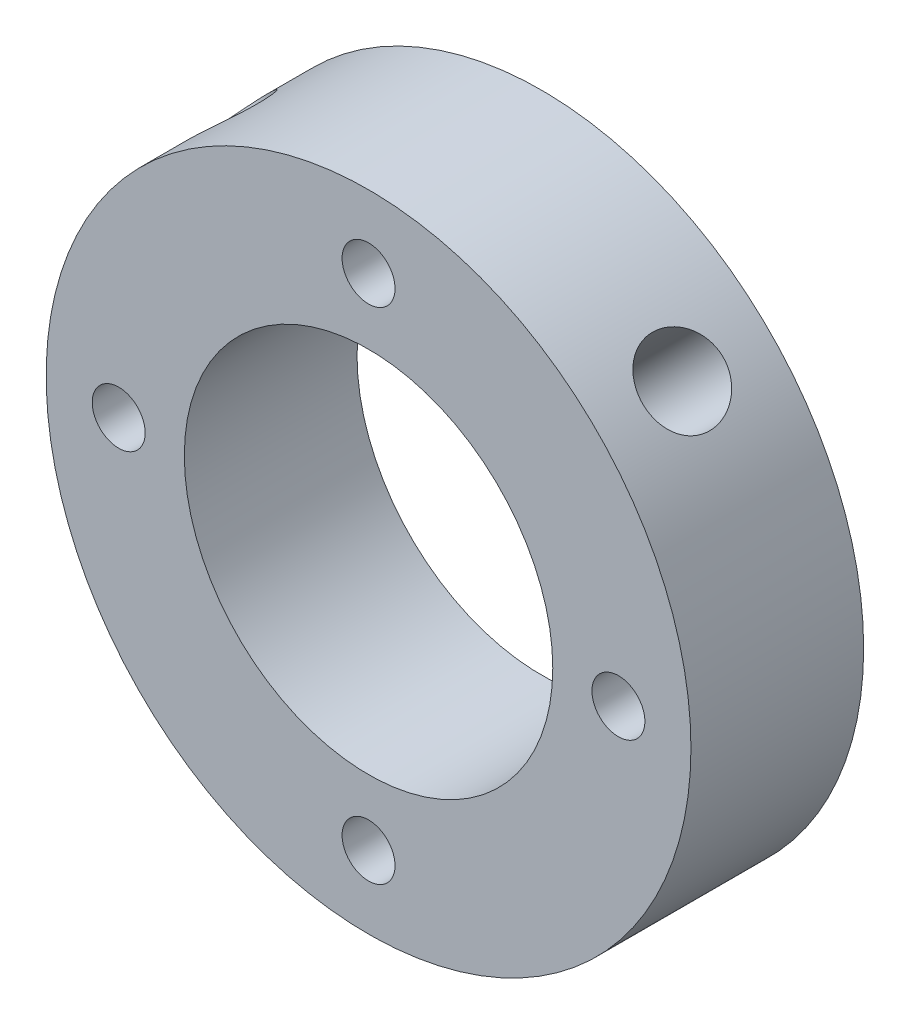
ISO-10303-21;
HEADER;
FILE_DESCRIPTION(('STEP AP214'),'2;1');
FILE_NAME('part.step','',(''),(''),'','','');
FILE_SCHEMA(('AUTOMOTIVE_DESIGN { 1 0 10303 214 1 1 1 1 }'));
ENDSEC;
DATA;
#1=APPLICATION_CONTEXT('core data for automotive mechanical design processes');
#2=APPLICATION_PROTOCOL_DEFINITION('international standard','automotive_design',2000,#1);
#3=PRODUCT_CONTEXT('',#1,'mechanical');
#4=PRODUCT('Part','Part','',(#3));
#5=PRODUCT_RELATED_PRODUCT_CATEGORY('part','',(#4));
#6=PRODUCT_DEFINITION_FORMATION('','',#4);
#7=PRODUCT_DEFINITION_CONTEXT('part definition',#1,'design');
#8=PRODUCT_DEFINITION('design','',#6,#7);
#9=PRODUCT_DEFINITION_SHAPE('','',#8);
#10=(LENGTH_UNIT() NAMED_UNIT(*) SI_UNIT(.MILLI.,.METRE.));
#11=(NAMED_UNIT(*) PLANE_ANGLE_UNIT() SI_UNIT($,.RADIAN.));
#12=(NAMED_UNIT(*) SI_UNIT($,.STERADIAN.) SOLID_ANGLE_UNIT());
#13=UNCERTAINTY_MEASURE_WITH_UNIT(LENGTH_MEASURE(1.E-05),#10,'distance_accuracy_value','');
#14=(GEOMETRIC_REPRESENTATION_CONTEXT(3) GLOBAL_UNCERTAINTY_ASSIGNED_CONTEXT((#13)) GLOBAL_UNIT_ASSIGNED_CONTEXT((#10,
#11,#12)) REPRESENTATION_CONTEXT('',''));
#15=CARTESIAN_POINT('',(0.,0.,0.));
#16=DIRECTION('',(0.,0.,1.));
#17=DIRECTION('',(1.,0.,0.));
#18=AXIS2_PLACEMENT_3D('',#15,#16,#17);
#19=CARTESIAN_POINT('',(0.,0.,9.5));
#20=DIRECTION('',(0.,0.,1.));
#21=DIRECTION('',(1.,0.,0.));
#22=AXIS2_PLACEMENT_3D('',#19,#20,#21);
#23=PLANE('',#22);
#24=CARTESIAN_POINT('',(0.,10.85,9.5));
#25=DIRECTION('',(0.,0.,1.));
#26=DIRECTION('',(1.,0.,0.));
#27=AXIS2_PLACEMENT_3D('',#24,#25,#26);
#28=CIRCLE('',#27,1.15);
#29=CARTESIAN_POINT('',(1.15,10.85,9.5));
#30=VERTEX_POINT('',#29);
#31=EDGE_CURVE('E97',#30,#30,#28,.T.);
#32=ORIENTED_EDGE('',*,*,#31,.F.);
#33=EDGE_LOOP('',(#32));
#34=FACE_BOUND('',#33,.T.);
#35=CARTESIAN_POINT('',(10.85,0.,9.5));
#36=DIRECTION('',(0.,0.,1.));
#37=DIRECTION('',(1.,0.,0.));
#38=AXIS2_PLACEMENT_3D('',#35,#36,#37);
#39=CIRCLE('',#38,1.15);
#40=CARTESIAN_POINT('',(12.,0.,9.5));
#41=VERTEX_POINT('',#40);
#42=EDGE_CURVE('E100',#41,#41,#39,.T.);
#43=ORIENTED_EDGE('',*,*,#42,.F.);
#44=EDGE_LOOP('',(#43));
#45=FACE_BOUND('',#44,.T.);
#46=CARTESIAN_POINT('',(0.,-10.85,9.5));
#47=DIRECTION('',(0.,0.,1.));
#48=DIRECTION('',(1.,0.,0.));
#49=AXIS2_PLACEMENT_3D('',#46,#47,#48);
#50=CIRCLE('',#49,1.15);
#51=CARTESIAN_POINT('',(1.15,-10.85,9.5));
#52=VERTEX_POINT('',#51);
#53=EDGE_CURVE('E106',#52,#52,#50,.T.);
#54=ORIENTED_EDGE('',*,*,#53,.F.);
#55=EDGE_LOOP('',(#54));
#56=FACE_BOUND('',#55,.T.);
#57=CARTESIAN_POINT('',(-10.85,0.,9.5));
#58=DIRECTION('',(0.,0.,1.));
#59=DIRECTION('',(1.,0.,0.));
#60=AXIS2_PLACEMENT_3D('',#57,#58,#59);
#61=CIRCLE('',#60,1.15);
#62=CARTESIAN_POINT('',(-9.7,0.,9.5));
#63=VERTEX_POINT('',#62);
#64=EDGE_CURVE('E112',#63,#63,#61,.T.);
#65=ORIENTED_EDGE('',*,*,#64,.F.);
#66=EDGE_LOOP('',(#65));
#67=FACE_BOUND('',#66,.T.);
#68=CARTESIAN_POINT('',(0.,0.,9.5));
#69=DIRECTION('',(0.,0.,1.));
#70=DIRECTION('',(1.,0.,0.));
#71=AXIS2_PLACEMENT_3D('',#68,#69,#70);
#72=CIRCLE('',#71,14.);
#73=CARTESIAN_POINT('',(14.,0.,9.5));
#74=VERTEX_POINT('',#73);
#75=EDGE_CURVE('E10',#74,#74,#72,.T.);
#76=ORIENTED_EDGE('',*,*,#75,.T.);
#77=EDGE_LOOP('',(#76));
#78=FACE_BOUND('',#77,.T.);
#79=CARTESIAN_POINT('',(0.,0.,9.5));
#80=DIRECTION('',(0.,0.,1.));
#81=DIRECTION('',(1.,0.,0.));
#82=AXIS2_PLACEMENT_3D('',#79,#80,#81);
#83=CIRCLE('',#82,8.);
#84=CARTESIAN_POINT('',(8.,0.,9.5));
#85=VERTEX_POINT('',#84);
#86=EDGE_CURVE('E56',#85,#85,#83,.T.);
#87=ORIENTED_EDGE('',*,*,#86,.F.);
#88=EDGE_LOOP('',(#87));
#89=FACE_BOUND('',#88,.T.);
#90=ADVANCED_FACE('F37',(#34,#45,#56,#67,#78,#89),#23,.T.);
#91=CARTESIAN_POINT('',(0.,0.,2.));
#92=DIRECTION('',(0.,0.,1.));
#93=DIRECTION('',(1.,0.,0.));
#94=AXIS2_PLACEMENT_3D('',#91,#92,#93);
#95=PLANE('',#94);
#96=CARTESIAN_POINT('',(0.,10.85,2.));
#97=DIRECTION('',(0.,0.,1.));
#98=DIRECTION('',(1.,0.,0.));
#99=AXIS2_PLACEMENT_3D('',#96,#97,#98);
#100=CIRCLE('',#99,1.15);
#101=CARTESIAN_POINT('',(1.15,10.85,2.));
#102=VERTEX_POINT('',#101);
#103=EDGE_CURVE('E94',#102,#102,#100,.T.);
#104=ORIENTED_EDGE('',*,*,#103,.T.);
#105=EDGE_LOOP('',(#104));
#106=FACE_BOUND('',#105,.T.);
#107=CARTESIAN_POINT('',(10.85,0.,2.));
#108=DIRECTION('',(0.,0.,1.));
#109=DIRECTION('',(1.,0.,0.));
#110=AXIS2_PLACEMENT_3D('',#107,#108,#109);
#111=CIRCLE('',#110,1.15);
#112=CARTESIAN_POINT('',(12.,0.,2.));
#113=VERTEX_POINT('',#112);
#114=EDGE_CURVE('E103',#113,#113,#111,.T.);
#115=ORIENTED_EDGE('',*,*,#114,.T.);
#116=EDGE_LOOP('',(#115));
#117=FACE_BOUND('',#116,.T.);
#118=CARTESIAN_POINT('',(0.,-10.85,2.));
#119=DIRECTION('',(0.,0.,1.));
#120=DIRECTION('',(1.,0.,0.));
#121=AXIS2_PLACEMENT_3D('',#118,#119,#120);
#122=CIRCLE('',#121,1.15);
#123=CARTESIAN_POINT('',(1.15,-10.85,2.));
#124=VERTEX_POINT('',#123);
#125=EDGE_CURVE('E109',#124,#124,#122,.T.);
#126=ORIENTED_EDGE('',*,*,#125,.T.);
#127=EDGE_LOOP('',(#126));
#128=FACE_BOUND('',#127,.T.);
#129=CARTESIAN_POINT('',(-10.85,0.,2.));
#130=DIRECTION('',(0.,0.,1.));
#131=DIRECTION('',(1.,0.,0.));
#132=AXIS2_PLACEMENT_3D('',#129,#130,#131);
#133=CIRCLE('',#132,1.15);
#134=CARTESIAN_POINT('',(-9.7,0.,2.));
#135=VERTEX_POINT('',#134);
#136=EDGE_CURVE('E90',#135,#135,#133,.T.);
#137=ORIENTED_EDGE('',*,*,#136,.T.);
#138=EDGE_LOOP('',(#137));
#139=FACE_BOUND('',#138,.T.);
#140=CARTESIAN_POINT('',(0.,0.,2.));
#141=DIRECTION('',(0.,0.,1.));
#142=DIRECTION('',(1.,0.,0.));
#143=AXIS2_PLACEMENT_3D('',#140,#141,#142);
#144=CIRCLE('',#143,14.);
#145=CARTESIAN_POINT('',(14.,0.,2.));
#146=VERTEX_POINT('',#145);
#147=EDGE_CURVE('E51',#146,#146,#144,.T.);
#148=ORIENTED_EDGE('',*,*,#147,.F.);
#149=EDGE_LOOP('',(#148));
#150=FACE_BOUND('',#149,.T.);
#151=CARTESIAN_POINT('',(0.,0.,2.));
#152=DIRECTION('',(0.,0.,1.));
#153=DIRECTION('',(1.,0.,0.));
#154=AXIS2_PLACEMENT_3D('',#151,#152,#153);
#155=CIRCLE('',#154,8.);
#156=CARTESIAN_POINT('',(8.,0.,2.));
#157=VERTEX_POINT('',#156);
#158=EDGE_CURVE('E59',#157,#157,#155,.T.);
#159=ORIENTED_EDGE('',*,*,#158,.T.);
#160=EDGE_LOOP('',(#159));
#161=FACE_BOUND('',#160,.T.);
#162=ADVANCED_FACE('F122',(#106,#117,#128,#139,#150,#161),#95,.F.);
#163=CARTESIAN_POINT('',(0.,0.,9.5));
#164=DIRECTION('',(0.,0.,-1.));
#165=DIRECTION('',(-1.,0.,0.));
#166=AXIS2_PLACEMENT_3D('',#163,#164,#165);
#167=CYLINDRICAL_SURFACE('',#166,14.);
#168=CARTESIAN_POINT('',(-11.0592875073581,8.58441377320511,5.75));
#169=CARTESIAN_POINT('',(-11.0592855589211,8.58441771018223,5.65211460134572));
#170=CARTESIAN_POINT('',(-11.0542001654367,8.59098021668698,5.55416802456663));
#171=CARTESIAN_POINT('',(-11.0339326687549,8.61699432920575,5.36100074221677));
#172=CARTESIAN_POINT('',(-11.0187400148505,8.63645940379871,5.26578299365207));
#173=CARTESIAN_POINT('',(-10.9785311882833,8.68751414802831,5.08089808251878));
#174=CARTESIAN_POINT('',(-10.9535216827794,8.71909558845236,4.99122720051694));
#175=CARTESIAN_POINT('',(-10.8941271060131,8.7931927373625,4.81989008372384));
#176=CARTESIAN_POINT('',(-10.8597436375035,8.83570657656516,4.73822248377986));
#177=CARTESIAN_POINT('',(-10.7820294866255,8.93037504061943,4.58473642701451));
#178=CARTESIAN_POINT('',(-10.7386549432799,8.98257678994448,4.51296923837678));
#179=CARTESIAN_POINT('',(-10.6439011144411,9.09465464754733,4.38176406174265));
#180=CARTESIAN_POINT('',(-10.5925214309282,9.15453113739091,4.32232668713372));
#181=CARTESIAN_POINT('',(-10.4826466017527,9.28014521992978,4.21728449434554));
#182=CARTESIAN_POINT('',(-10.424128488121,9.34590153969116,4.17172606843024));
#183=CARTESIAN_POINT('',(-10.301458527151,9.48094213828875,4.09603216004132));
#184=CARTESIAN_POINT('',(-10.23730688901,9.55022628608123,4.06589610515144));
#185=CARTESIAN_POINT('',(-10.1053338354276,9.68975730689718,4.0220555521659));
#186=CARTESIAN_POINT('',(-10.0375333989839,9.75999723756417,4.00826582503328));
#187=CARTESIAN_POINT('',(-9.89979880060828,9.89967683815097,3.99724523047442));
#188=CARTESIAN_POINT('',(-9.82986472272338,9.96911653944486,4.00001371163322));
#189=CARTESIAN_POINT('',(-9.69028455865743,10.1048410246416,4.0219626419302));
#190=CARTESIAN_POINT('',(-9.62063904289273,10.1711412504686,4.04105142893696));
#191=CARTESIAN_POINT('',(-9.48334907378325,10.2992675886158,4.09495582364095));
#192=CARTESIAN_POINT('',(-9.41570465850621,10.3610936158537,4.12977173031678));
#193=CARTESIAN_POINT('',(-9.28436693240001,10.4789477132399,4.21423954494865));
#194=CARTESIAN_POINT('',(-9.22068474264437,10.5349597350704,4.26393112041113));
#195=CARTESIAN_POINT('',(-9.09954755719383,10.6397678543135,4.37671085355122));
#196=CARTESIAN_POINT('',(-9.04209284727547,10.6885636206126,4.439799625628));
#197=CARTESIAN_POINT('',(-8.93498746393012,10.7782615721969,4.57809627301887));
#198=CARTESIAN_POINT('',(-8.88539281263153,10.8191075278302,4.65338403168267));
#199=CARTESIAN_POINT('',(-8.79624961824873,10.891708231941,4.81366708974772));
#200=CARTESIAN_POINT('',(-8.75670110665468,10.9234629519216,4.89866241957664));
#201=CARTESIAN_POINT('',(-8.6891002488769,10.9773136341209,5.07601864689363));
#202=CARTESIAN_POINT('',(-8.66105279028708,10.9994054901849,5.16838265596724));
#203=CARTESIAN_POINT('',(-8.61756022116899,11.033513799299,5.35781761746878));
#204=CARTESIAN_POINT('',(-8.6021145032958,11.0455307379138,5.4548883428161));
#205=CARTESIAN_POINT('',(-8.58449476243216,11.0592303312236,5.65028022739984));
#206=CARTESIAN_POINT('',(-8.58223192424446,11.0609821442008,5.74858853616216));
#207=CARTESIAN_POINT('',(-8.59082945024889,11.0543058495819,5.94427935076579));
#208=CARTESIAN_POINT('',(-8.60168953472678,11.0458779589655,6.04166187629552));
#209=CARTESIAN_POINT('',(-8.63604665114042,11.0190365260655,6.2324020345045));
#210=CARTESIAN_POINT('',(-8.65950095238134,11.0006567476126,6.32577213063329));
#211=CARTESIAN_POINT('',(-8.71812384950224,10.954255146006,6.50622690839721));
#212=CARTESIAN_POINT('',(-8.75329285695445,10.9262329840856,6.59331136906861));
#213=CARTESIAN_POINT('',(-8.83426339300529,10.8608701992697,6.7592282506691));
#214=CARTESIAN_POINT('',(-8.88012008906368,10.8234811488997,6.8380146657201));
#215=CARTESIAN_POINT('',(-8.98072362980795,10.7401517003047,6.98462958775452));
#216=CARTESIAN_POINT('',(-9.03547082029053,10.6942109694511,7.05245766830759));
#217=CARTESIAN_POINT('',(-9.15230536765501,10.5943962512693,7.17562293113408));
#218=CARTESIAN_POINT('',(-9.21443278413978,10.5404785376658,7.2308867127565));
#219=CARTESIAN_POINT('',(-9.34368707500626,10.4260707086251,7.32684675234366));
#220=CARTESIAN_POINT('',(-9.41081384858413,10.3655807256956,7.36754330393668));
#221=CARTESIAN_POINT('',(-9.54770106328009,10.2396300822277,7.43309245083562));
#222=CARTESIAN_POINT('',(-9.61745391582343,10.1741832628361,7.45798746722213));
#223=CARTESIAN_POINT('',(-9.7575864139591,10.0398666089808,7.49136486245873));
#224=CARTESIAN_POINT('',(-9.82796603114306,9.97099692901811,7.49984798141946));
#225=CARTESIAN_POINT('',(-9.96678351803119,9.83223237120011,7.50014694560451));
#226=CARTESIAN_POINT('',(-10.0352313513107,9.76234767725431,7.49207597239758));
#227=CARTESIAN_POINT('',(-10.1687939429678,9.62314591740449,7.45973557059842));
#228=CARTESIAN_POINT('',(-10.2339087036635,9.55382885110573,7.43546615327177));
#229=CARTESIAN_POINT('',(-10.3591217029429,9.41791589386504,7.37145331995521));
#230=CARTESIAN_POINT('',(-10.4192216898466,9.35131905872688,7.33171532443874));
#231=CARTESIAN_POINT('',(-10.5330318316626,9.2229392676423,7.23790507977471));
#232=CARTESIAN_POINT('',(-10.5867419105995,9.16115636893616,7.18383266021682));
#233=CARTESIAN_POINT('',(-10.6869595209451,9.04405244031377,7.06246974926453));
#234=CARTESIAN_POINT('',(-10.733417599931,8.98877636001254,6.99509504453344));
#235=CARTESIAN_POINT('',(-10.8177932267859,8.88705402374404,6.8492149391798));
#236=CARTESIAN_POINT('',(-10.8557087490116,8.84060986244107,6.77070690575637));
#237=CARTESIAN_POINT('',(-10.9224064600287,8.75807469221113,6.60444105411185));
#238=CARTESIAN_POINT('',(-10.9511528135076,8.72202435631506,6.51664868704544));
#239=CARTESIAN_POINT('',(-10.9987664681822,8.66190625724268,6.33460028158367));
#240=CARTESIAN_POINT('',(-11.0176445145888,8.63782546231483,6.24035140048762));
#241=CARTESIAN_POINT('',(-11.0406957269628,8.60832458708988,6.07967900906953));
#242=CARTESIAN_POINT('',(-11.0476611510808,8.59937445978017,6.0142689339237));
#243=CARTESIAN_POINT('',(-11.0569576836076,8.58741774198286,5.88258192502315));
#244=CARTESIAN_POINT('',(-11.0592888271781,8.58441110640023,5.81630499784933));
#245=CARTESIAN_POINT('',(-11.0592875073581,8.58441377320511,5.75));
#246=B_SPLINE_CURVE_WITH_KNOTS('',3,(#168,#169,#170,#171,#172,#173,#174,#175,#176,#177,#178,
#179,#180,#181,#182,#183,#184,#185,#186,#187,#188,#189,#190,#191,#192,#193,#194,#195,#196,#197,
#198,#199,#200,#201,#202,#203,#204,#205,#206,#207,#208,#209,#210,#211,#212,#213,#214,#215,#216,
#217,#218,#219,#220,#221,#222,#223,#224,#225,#226,#227,#228,#229,#230,#231,#232,#233,#234,#235,
#236,#237,#238,#239,#240,#241,#242,#243,#244,#245),.UNSPECIFIED.,.T.,.F.,(4,2,2,2,2,2,2,2,2,2,2,
2,2,2,2,2,2,2,2,2,2,2,2,2,2,2,2,2,2,2,2,2,2,2,2,2,2,2,4),(0.,0.293413972235467,
0.587134713306668,0.880656316806842,1.17412776565429,1.46906604284346,1.76401898919805,
2.05994730302019,2.35586463237881,2.6502321785902,2.94458814419076,3.23730165453127,
3.53002072970253,3.82352743088963,4.11704759528374,4.4125738816444,4.70810109433598,
5.00375376717307,5.29939219009332,5.59303652464118,5.88667460028981,6.17932263404913,
6.47198095048298,6.76618473680878,7.06039996896368,7.3562922012464,7.65217846896215,
7.94726699749459,8.24234221840969,8.53540671401779,8.82847100580752,9.12143269480863,
9.41439786674974,9.70928090223586,10.0042337880788,10.3003256839338,10.5960945018741,
10.7948469274307,10.9935978449883),.UNSPECIFIED.);
#247=CARTESIAN_POINT('',(-11.0592875073581,8.58441377320511,5.75));
#248=VERTEX_POINT('',#247);
#249=EDGE_CURVE('E68',#248,#248,#246,.T.);
#250=ORIENTED_EDGE('',*,*,#249,.T.);
#251=EDGE_LOOP('',(#250));
#252=FACE_BOUND('',#251,.T.);
#253=CARTESIAN_POINT('',(8.58441377320512,11.0592875073581,5.75));
#254=CARTESIAN_POINT('',(8.58441771018223,11.0592855589211,5.65211460134572));
#255=CARTESIAN_POINT('',(8.59098021668698,11.0542001654367,5.55416802456663));
#256=CARTESIAN_POINT('',(8.61699432920575,11.0339326687549,5.36100074221677));
#257=CARTESIAN_POINT('',(8.63645940379871,11.0187400148505,5.26578299365207));
#258=CARTESIAN_POINT('',(8.68751414802832,10.9785311882833,5.08089808251878));
#259=CARTESIAN_POINT('',(8.71909558845237,10.9535216827794,4.99122720051694));
#260=CARTESIAN_POINT('',(8.7931927373625,10.8941271060131,4.81989008372384));
#261=CARTESIAN_POINT('',(8.83570657656516,10.8597436375035,4.73822248377986));
#262=CARTESIAN_POINT('',(8.93037504061943,10.7820294866255,4.58473642701451));
#263=CARTESIAN_POINT('',(8.98257678994448,10.7386549432799,4.51296923837678));
#264=CARTESIAN_POINT('',(9.09465464754733,10.6439011144411,4.38176406174265));
#265=CARTESIAN_POINT('',(9.15453113739092,10.5925214309282,4.32232668713372));
#266=CARTESIAN_POINT('',(9.28014521992978,10.4826466017527,4.21728449434554));
#267=CARTESIAN_POINT('',(9.34590153969116,10.424128488121,4.17172606843024));
#268=CARTESIAN_POINT('',(9.48094213828875,10.301458527151,4.09603216004132));
#269=CARTESIAN_POINT('',(9.55022628608123,10.23730688901,4.06589610515144));
#270=CARTESIAN_POINT('',(9.68975730689718,10.1053338354276,4.0220555521659));
#271=CARTESIAN_POINT('',(9.75999723756417,10.0375333989839,4.00826582503328));
#272=CARTESIAN_POINT('',(9.89967683815098,9.89979880060828,3.99724523047442));
#273=CARTESIAN_POINT('',(9.96911653944487,9.82986472272337,4.00001371163322));
#274=CARTESIAN_POINT('',(10.1048410246416,9.69028455865742,4.0219626419302));
#275=CARTESIAN_POINT('',(10.1711412504686,9.62063904289272,4.04105142893696));
#276=CARTESIAN_POINT('',(10.2992675886158,9.48334907378324,4.09495582364095));
#277=CARTESIAN_POINT('',(10.3610936158537,9.4157046585062,4.12977173031678));
#278=CARTESIAN_POINT('',(10.4789477132399,9.2843669324,4.21423954494865));
#279=CARTESIAN_POINT('',(10.5349597350704,9.22068474264436,4.26393112041113));
#280=CARTESIAN_POINT('',(10.6397678543135,9.09954755719382,4.37671085355122));
#281=CARTESIAN_POINT('',(10.6885636206126,9.04209284727547,4.439799625628));
#282=CARTESIAN_POINT('',(10.7782615721969,8.93498746393012,4.57809627301887));
#283=CARTESIAN_POINT('',(10.8191075278302,8.88539281263153,4.65338403168267));
#284=CARTESIAN_POINT('',(10.891708231941,8.79624961824873,4.81366708974772));
#285=CARTESIAN_POINT('',(10.9234629519216,8.75670110665467,4.89866241957664));
#286=CARTESIAN_POINT('',(10.9773136341209,8.6891002488769,5.07601864689363));
#287=CARTESIAN_POINT('',(10.9994054901849,8.66105279028707,5.16838265596724));
#288=CARTESIAN_POINT('',(11.033513799299,8.61756022116898,5.35781761746878));
#289=CARTESIAN_POINT('',(11.0455307379138,8.6021145032958,5.45488834281611));
#290=CARTESIAN_POINT('',(11.0592303312236,8.58449476243216,5.65028022739984));
#291=CARTESIAN_POINT('',(11.0609821442008,8.58223192424446,5.74858853616216));
#292=CARTESIAN_POINT('',(11.0543058495819,8.59082945024889,5.94427935076579));
#293=CARTESIAN_POINT('',(11.0458779589655,8.60168953472678,6.04166187629552));
#294=CARTESIAN_POINT('',(11.0190365260655,8.63604665114042,6.23240203450451));
#295=CARTESIAN_POINT('',(11.0006567476126,8.65950095238134,6.32577213063329));
#296=CARTESIAN_POINT('',(10.954255146006,8.71812384950223,6.50622690839721));
#297=CARTESIAN_POINT('',(10.9262329840856,8.75329285695445,6.59331136906861));
#298=CARTESIAN_POINT('',(10.8608701992697,8.83426339300528,6.7592282506691));
#299=CARTESIAN_POINT('',(10.8234811488997,8.88012008906368,6.8380146657201));
#300=CARTESIAN_POINT('',(10.7401517003047,8.98072362980795,6.98462958775452));
#301=CARTESIAN_POINT('',(10.6942109694511,9.03547082029053,7.05245766830759));
#302=CARTESIAN_POINT('',(10.5943962512693,9.152305367655,7.17562293113408));
#303=CARTESIAN_POINT('',(10.5404785376658,9.21443278413978,7.2308867127565));
#304=CARTESIAN_POINT('',(10.4260707086251,9.34368707500626,7.32684675234366));
#305=CARTESIAN_POINT('',(10.3655807256956,9.41081384858413,7.36754330393668));
#306=CARTESIAN_POINT('',(10.2396300822277,9.54770106328009,7.43309245083562));
#307=CARTESIAN_POINT('',(10.1741832628361,9.61745391582343,7.45798746722213));
#308=CARTESIAN_POINT('',(10.0398666089808,9.75758641395909,7.49136486245873));
#309=CARTESIAN_POINT('',(9.97099692901811,9.82796603114306,7.49984798141946));
#310=CARTESIAN_POINT('',(9.83223237120012,9.96678351803119,7.50014694560451));
#311=CARTESIAN_POINT('',(9.76234767725432,10.0352313513107,7.49207597239758));
#312=CARTESIAN_POINT('',(9.62314591740449,10.1687939429678,7.45973557059841));
#313=CARTESIAN_POINT('',(9.55382885110573,10.2339087036635,7.43546615327177));
#314=CARTESIAN_POINT('',(9.41791589386505,10.3591217029429,7.37145331995521));
#315=CARTESIAN_POINT('',(9.35131905872688,10.4192216898466,7.33171532443874));
#316=CARTESIAN_POINT('',(9.2229392676423,10.5330318316626,7.23790507977471));
#317=CARTESIAN_POINT('',(9.16115636893617,10.5867419105995,7.18383266021681));
#318=CARTESIAN_POINT('',(9.04405244031377,10.6869595209451,7.06246974926453));
#319=CARTESIAN_POINT('',(8.98877636001254,10.733417599931,6.99509504453344));
#320=CARTESIAN_POINT('',(8.88705402374405,10.8177932267859,6.84921493917979));
#321=CARTESIAN_POINT('',(8.84060986244107,10.8557087490116,6.77070690575636));
#322=CARTESIAN_POINT('',(8.75807469221113,10.9224064600287,6.60444105411184));
#323=CARTESIAN_POINT('',(8.72202435631506,10.9511528135076,6.51664868704543));
#324=CARTESIAN_POINT('',(8.66190625724268,10.9987664681822,6.33460028158366));
#325=CARTESIAN_POINT('',(8.63782546231484,11.0176445145888,6.24035140048762));
#326=CARTESIAN_POINT('',(8.60832458708988,11.0406957269628,6.07967900906952));
#327=CARTESIAN_POINT('',(8.59937445978017,11.0476611510808,6.0142689339237));
#328=CARTESIAN_POINT('',(8.58741774198286,11.0569576836076,5.88258192502315));
#329=CARTESIAN_POINT('',(8.58441110640023,11.0592888271781,5.81630499784933));
#330=CARTESIAN_POINT('',(8.58441377320512,11.0592875073581,5.75));
#331=B_SPLINE_CURVE_WITH_KNOTS('',3,(#253,#254,#255,#256,#257,#258,#259,#260,#261,#262,#263,
#264,#265,#266,#267,#268,#269,#270,#271,#272,#273,#274,#275,#276,#277,#278,#279,#280,#281,#282,
#283,#284,#285,#286,#287,#288,#289,#290,#291,#292,#293,#294,#295,#296,#297,#298,#299,#300,#301,
#302,#303,#304,#305,#306,#307,#308,#309,#310,#311,#312,#313,#314,#315,#316,#317,#318,#319,#320,
#321,#322,#323,#324,#325,#326,#327,#328,#329,#330),.UNSPECIFIED.,.T.,.F.,(4,2,2,2,2,2,2,2,2,2,2,
2,2,2,2,2,2,2,2,2,2,2,2,2,2,2,2,2,2,2,2,2,2,2,2,2,2,2,4),(0.,0.293413972235466,
0.587134713306667,0.880656316806841,1.17412776565429,1.46906604284346,1.76401898919805,
2.05994730302018,2.35586463237881,2.6502321785902,2.94458814419076,3.23730165453127,
3.53002072970253,3.82352743088963,4.11704759528373,4.41257388164439,4.70810109433598,
5.00375376717306,5.29939219009332,5.59303652464118,5.88667460028981,6.17932263404913,
6.47198095048297,6.76618473680878,7.06039996896368,7.3562922012464,7.65217846896215,
7.94726699749458,8.24234221840968,8.53540671401779,8.82847100580752,9.12143269480863,
9.41439786674974,9.70928090223585,10.0042337880788,10.3003256839338,10.5960945018741,
10.7948469274306,10.9935978449883),.UNSPECIFIED.);
#332=CARTESIAN_POINT('',(8.58441377320512,11.0592875073581,5.75));
#333=VERTEX_POINT('',#332);
#334=EDGE_CURVE('E67',#333,#333,#331,.T.);
#335=ORIENTED_EDGE('',*,*,#334,.T.);
#336=EDGE_LOOP('',(#335));
#337=FACE_BOUND('',#336,.T.);
#338=ORIENTED_EDGE('',*,*,#75,.F.);
#339=EDGE_LOOP('',(#338));
#340=FACE_BOUND('',#339,.T.);
#341=ORIENTED_EDGE('',*,*,#147,.T.);
#342=EDGE_LOOP('',(#341));
#343=FACE_BOUND('',#342,.T.);
#344=ADVANCED_FACE('F39',(#252,#337,#340,#343),#167,.T.);
#345=CARTESIAN_POINT('',(0.,0.,9.5));
#346=DIRECTION('',(0.,0.,-1.));
#347=DIRECTION('',(-1.,0.,0.));
#348=AXIS2_PLACEMENT_3D('',#345,#346,#347);
#349=CYLINDRICAL_SURFACE('',#348,8.);
#350=CARTESIAN_POINT('',(-6.75728740853138,4.28241367437843,5.75));
#351=CARTESIAN_POINT('',(-6.75728643581891,4.28241742043915,5.6529719865672));
#352=CARTESIAN_POINT('',(-6.75285509491892,4.28943219210488,5.55590386868923));
#353=CARTESIAN_POINT('',(-6.73515694329336,4.31716593041878,5.36452809547803));
#354=CARTESIAN_POINT('',(-6.72188374551932,4.33789480358069,5.2702224871333));
#355=CARTESIAN_POINT('',(-6.68662088146166,4.39205386093302,5.08716775159997));
#356=CARTESIAN_POINT('',(-6.66464077981807,4.42547010622337,4.99841265057484));
#357=CARTESIAN_POINT('',(-6.6121370674966,4.50353711713557,4.82873191615454));
#358=CARTESIAN_POINT('',(-6.58161363249329,4.54818765174743,4.74780612181319));
#359=CARTESIAN_POINT('',(-6.5117506986383,4.64767071106652,4.59471253780589));
#360=CARTESIAN_POINT('',(-6.47228443683237,4.70264747442849,4.52269629807493));
#361=CARTESIAN_POINT('',(-6.38521848127705,4.82019972127882,4.39079338749152));
#362=CARTESIAN_POINT('',(-6.33761815575134,4.88277579489964,4.33090765961146));
#363=CARTESIAN_POINT('',(-6.23438082445478,5.0139328586227,4.22436623233176));
#364=CARTESIAN_POINT('',(-6.17866456268551,5.08257008051204,4.17785629524105));
#365=CARTESIAN_POINT('',(-6.06058047843026,5.22281107829635,4.10032973697399));
#366=CARTESIAN_POINT('',(-5.99821340344953,5.29441452025671,4.06931137687435));
#367=CARTESIAN_POINT('',(-5.86926128775424,5.43699018131876,4.0241251174166));
#368=CARTESIAN_POINT('',(-5.80275767898809,5.50795470371953,4.00970073060677));
#369=CARTESIAN_POINT('',(-5.66643300556401,5.64810486238765,3.99730994048858));
#370=CARTESIAN_POINT('',(-5.59661232141432,5.7172907012948,3.99934165397865));
#371=CARTESIAN_POINT('',(-5.45694065885707,5.85072421217797,4.01961437044523));
#372=CARTESIAN_POINT('',(-5.38711042051306,5.91503588865531,4.03757891107517));
#373=CARTESIAN_POINT('',(-5.2484313985945,6.03842596202247,4.0887667801185));
#374=CARTESIAN_POINT('',(-5.17958265954779,6.09750412211241,4.12199079855425));
#375=CARTESIAN_POINT('',(-5.04462045156654,6.2096349145785,4.2029990480669));
#376=CARTESIAN_POINT('',(-4.97853069129534,6.26264027931818,4.25088806992256));
#377=CARTESIAN_POINT('',(-4.85187975514393,6.36126682027886,4.35978878699777));
#378=CARTESIAN_POINT('',(-4.7913193341689,6.40688698887505,4.42080227025849));
#379=CARTESIAN_POINT('',(-4.67670939048021,6.49103666483952,4.55572505085902));
#380=CARTESIAN_POINT('',(-4.62282160112357,6.5293988440231,4.62987630560751));
#381=CARTESIAN_POINT('',(-4.52519370150899,6.59743687627674,4.78817892039438));
#382=CARTESIAN_POINT('',(-4.48145386643818,6.6271124937947,4.87233055152438));
#383=CARTESIAN_POINT('',(-4.40587953681626,6.67759738871818,5.04862144608706));
#384=CARTESIAN_POINT('',(-4.37408071094507,6.69838012782498,5.14078364370769));
#385=CARTESIAN_POINT('',(-4.32406351384026,6.73077796444658,5.33025868273823));
#386=CARTESIAN_POINT('',(-4.30584298783509,6.74239451658183,5.42757070428457));
#387=CARTESIAN_POINT('',(-4.28410636016127,6.75622653145643,5.6224569275024));
#388=CARTESIAN_POINT('',(-4.28029798613782,6.75862886838208,5.7199853182606));
#389=CARTESIAN_POINT('',(-4.28676262845681,6.75453036478645,5.9143807036213));
#390=CARTESIAN_POINT('',(-4.29703467722516,6.74803013602892,6.01124774321065));
#391=CARTESIAN_POINT('',(-4.33095199526395,6.72631015249794,6.20039091520493));
#392=CARTESIAN_POINT('',(-4.3544374889898,6.71119454594866,6.29270782401673));
#393=CARTESIAN_POINT('',(-4.41359430759669,6.67243793646259,6.4714579700726));
#394=CARTESIAN_POINT('',(-4.44926679906692,6.64879611734983,6.55789064310333));
#395=CARTESIAN_POINT('',(-4.53192156437374,6.59273913643557,6.72388497843437));
#396=CARTESIAN_POINT('',(-4.57906951618443,6.56019449772473,6.80332035921827));
#397=CARTESIAN_POINT('',(-4.68248056226202,6.48678561819451,6.95173168369394));
#398=CARTESIAN_POINT('',(-4.7387447886566,6.4459203438939,7.02070632623003));
#399=CARTESIAN_POINT('',(-4.85940010318161,6.35547083683945,7.14755337012295));
#400=CARTESIAN_POINT('',(-4.92392316242068,6.30573823908874,7.20519478022894));
#401=CARTESIAN_POINT('',(-5.05786425533932,6.19881772864504,7.30608724272948));
#402=CARTESIAN_POINT('',(-5.12728206021031,6.14163016433416,7.349338967241));
#403=CARTESIAN_POINT('',(-5.26809773476028,6.0212674911324,7.41990264693481));
#404=CARTESIAN_POINT('',(-5.33947995074544,5.95813336776876,7.44731558387298));
#405=CARTESIAN_POINT('',(-5.48223283765318,5.82704937705271,7.4857388611449));
#406=CARTESIAN_POINT('',(-5.55360350874495,5.7591002114348,7.49675158648308));
#407=CARTESIAN_POINT('',(-5.69260216321537,5.62171092173695,7.50195457827283));
#408=CARTESIAN_POINT('',(-5.76027710418475,5.55233113744564,7.49648972318037));
#409=CARTESIAN_POINT('',(-5.8915695483545,5.4128168134945,7.46966411740783));
#410=CARTESIAN_POINT('',(-5.95518712449669,5.34268228742964,7.44830365258081));
#411=CARTESIAN_POINT('',(-6.07664791203298,5.20411560056439,7.39045845606348));
#412=CARTESIAN_POINT('',(-6.13450905774764,5.1356786852191,7.35402264734774));
#413=CARTESIAN_POINT('',(-6.24357328681382,5.0025202413903,7.26710874006052));
#414=CARTESIAN_POINT('',(-6.29477572302234,4.93779907437181,7.21662927811655));
#415=CARTESIAN_POINT('',(-6.39064384827594,4.81310512931095,7.10193650784483));
#416=CARTESIAN_POINT('',(-6.43516700216799,4.7532458099922,7.03748068449274));
#417=CARTESIAN_POINT('',(-6.51595605704299,4.64188119877391,6.897153999639));
#418=CARTESIAN_POINT('',(-6.55221996499043,4.59037792412896,6.82128039023581));
#419=CARTESIAN_POINT('',(-6.61655938010037,4.49715481968186,6.6590516072625));
#420=CARTESIAN_POINT('',(-6.64451888710903,4.45557504840139,6.57256982229048));
#421=CARTESIAN_POINT('',(-6.69133209768395,4.38496104880475,6.39237797670048));
#422=CARTESIAN_POINT('',(-6.71019350772666,4.35591620507397,6.29867411180724));
#423=CARTESIAN_POINT('',(-6.73537258309256,4.31684547391851,6.12906263930061));
#424=CARTESIAN_POINT('',(-6.74358595705933,4.30396939286267,6.05407494852323));
#425=CARTESIAN_POINT('',(-6.7545436193223,4.28675222671175,5.90273307766719));
#426=CARTESIAN_POINT('',(-6.75728817423572,4.28241072553687,5.82637896438781));
#427=CARTESIAN_POINT('',(-6.75728740853138,4.28241367437843,5.75));
#428=B_SPLINE_CURVE_WITH_KNOTS('',3,(#350,#351,#352,#353,#354,#355,#356,#357,#358,#359,#360,
#361,#362,#363,#364,#365,#366,#367,#368,#369,#370,#371,#372,#373,#374,#375,#376,#377,#378,#379,
#380,#381,#382,#383,#384,#385,#386,#387,#388,#389,#390,#391,#392,#393,#394,#395,#396,#397,#398,
#399,#400,#401,#402,#403,#404,#405,#406,#407,#408,#409,#410,#411,#412,#413,#414,#415,#416,#417,
#418,#419,#420,#421,#422,#423,#424,#425,#426,#427),.UNSPECIFIED.,.T.,.F.,(4,2,2,2,2,2,2,2,2,2,2,
2,2,2,2,2,2,2,2,2,2,2,2,2,2,2,2,2,2,2,2,2,2,2,2,2,2,2,4),(0.,0.290804115870692,
0.581818526599534,0.872514137052687,1.16320377043854,1.45830491896335,1.75342899855111,
2.05165686348641,2.34985124493558,2.64337184515389,2.93685885596571,3.2253508676411,
3.51385592599757,3.8044726414071,4.09512897475707,4.39183436537594,4.68854780096224,
4.98614062158782,5.28368620646371,5.57516431760517,5.86662240004893,6.15462969113393,
6.44266455918166,6.7351342450112,7.02764027980829,7.32560034403599,7.62354648911712,
7.91957146995089,8.21555339708043,8.50538367763981,8.79520874626514,9.08410055231566,
9.37302041407614,9.6674247415535,9.96190003653334,10.2603137141584,10.5584741768494,
10.7874018788084,11.0163184197546),.UNSPECIFIED.);
#429=CARTESIAN_POINT('',(-6.75728740853138,4.28241367437843,5.75));
#430=VERTEX_POINT('',#429);
#431=EDGE_CURVE('E42',#430,#430,#428,.T.);
#432=ORIENTED_EDGE('',*,*,#431,.F.);
#433=EDGE_LOOP('',(#432));
#434=FACE_BOUND('',#433,.T.);
#435=CARTESIAN_POINT('',(4.28241367437843,6.75728740853137,5.75));
#436=CARTESIAN_POINT('',(4.28241742043916,6.7572864358189,5.6529719865672));
#437=CARTESIAN_POINT('',(4.28943219210489,6.75285509491892,5.55590386868923));
#438=CARTESIAN_POINT('',(4.31716593041878,6.73515694329336,5.36452809547803));
#439=CARTESIAN_POINT('',(4.33789480358069,6.72188374551932,5.2702224871333));
#440=CARTESIAN_POINT('',(4.39205386093303,6.68662088146166,5.08716775159997));
#441=CARTESIAN_POINT('',(4.42547010622338,6.66464077981807,4.99841265057484));
#442=CARTESIAN_POINT('',(4.50353711713558,6.6121370674966,4.82873191615454));
#443=CARTESIAN_POINT('',(4.54818765174744,6.58161363249329,4.74780612181319));
#444=CARTESIAN_POINT('',(4.64767071106652,6.5117506986383,4.59471253780589));
#445=CARTESIAN_POINT('',(4.70264747442849,6.47228443683237,4.52269629807493));
#446=CARTESIAN_POINT('',(4.82019972127882,6.38521848127704,4.39079338749152));
#447=CARTESIAN_POINT('',(4.88277579489965,6.33761815575134,4.33090765961146));
#448=CARTESIAN_POINT('',(5.0139328586227,6.23438082445478,4.22436623233177));
#449=CARTESIAN_POINT('',(5.08257008051205,6.17866456268551,4.17785629524105));
#450=CARTESIAN_POINT('',(5.22281107829635,6.06058047843026,4.10032973697399));
#451=CARTESIAN_POINT('',(5.29441452025671,5.99821340344953,4.06931137687435));
#452=CARTESIAN_POINT('',(5.43699018131876,5.86926128775424,4.0241251174166));
#453=CARTESIAN_POINT('',(5.50795470371953,5.80275767898808,4.00970073060678));
#454=CARTESIAN_POINT('',(5.64810486238766,5.66643300556401,3.99730994048858));
#455=CARTESIAN_POINT('',(5.7172907012948,5.59661232141432,3.99934165397865));
#456=CARTESIAN_POINT('',(5.85072421217797,5.45694065885707,4.01961437044523));
#457=CARTESIAN_POINT('',(5.91503588865531,5.38711042051306,4.03757891107517));
#458=CARTESIAN_POINT('',(6.03842596202248,5.2484313985945,4.0887667801185));
#459=CARTESIAN_POINT('',(6.09750412211241,5.17958265954779,4.12199079855425));
#460=CARTESIAN_POINT('',(6.2096349145785,5.04462045156653,4.2029990480669));
#461=CARTESIAN_POINT('',(6.26264027931818,4.97853069129534,4.25088806992256));
#462=CARTESIAN_POINT('',(6.36126682027887,4.85187975514392,4.35978878699777));
#463=CARTESIAN_POINT('',(6.40688698887505,4.7913193341689,4.42080227025849));
#464=CARTESIAN_POINT('',(6.49103666483952,4.6767093904802,4.55572505085902));
#465=CARTESIAN_POINT('',(6.5293988440231,4.62282160112356,4.62987630560751));
#466=CARTESIAN_POINT('',(6.59743687627675,4.52519370150899,4.78817892039438));
#467=CARTESIAN_POINT('',(6.6271124937947,4.48145386643818,4.87233055152438));
#468=CARTESIAN_POINT('',(6.67759738871819,4.40587953681626,5.04862144608706));
#469=CARTESIAN_POINT('',(6.69838012782498,4.37408071094507,5.14078364370769));
#470=CARTESIAN_POINT('',(6.73077796444658,4.32406351384026,5.33025868273823));
#471=CARTESIAN_POINT('',(6.74239451658183,4.30584298783509,5.42757070428457));
#472=CARTESIAN_POINT('',(6.75622653145643,4.28410636016127,5.6224569275024));
#473=CARTESIAN_POINT('',(6.75862886838208,4.28029798613782,5.71998531826059));
#474=CARTESIAN_POINT('',(6.75453036478645,4.28676262845681,5.9143807036213));
#475=CARTESIAN_POINT('',(6.74803013602893,4.29703467722516,6.01124774321065));
#476=CARTESIAN_POINT('',(6.72631015249794,4.33095199526394,6.20039091520493));
#477=CARTESIAN_POINT('',(6.71119454594867,4.3544374889898,6.29270782401673));
#478=CARTESIAN_POINT('',(6.67243793646259,4.41359430759668,6.4714579700726));
#479=CARTESIAN_POINT('',(6.64879611734983,4.44926679906692,6.55789064310333));
#480=CARTESIAN_POINT('',(6.59273913643557,4.53192156437374,6.72388497843437));
#481=CARTESIAN_POINT('',(6.56019449772474,4.57906951618442,6.80332035921827));
#482=CARTESIAN_POINT('',(6.48678561819451,4.68248056226202,6.95173168369394));
#483=CARTESIAN_POINT('',(6.44592034389391,4.73874478865659,7.02070632623003));
#484=CARTESIAN_POINT('',(6.35547083683945,4.85940010318161,7.14755337012295));
#485=CARTESIAN_POINT('',(6.30573823908874,4.92392316242068,7.20519478022894));
#486=CARTESIAN_POINT('',(6.19881772864504,5.05786425533932,7.30608724272948));
#487=CARTESIAN_POINT('',(6.14163016433417,5.12728206021031,7.349338967241));
#488=CARTESIAN_POINT('',(6.0212674911324,5.26809773476028,7.41990264693481));
#489=CARTESIAN_POINT('',(5.95813336776877,5.33947995074543,7.44731558387298));
#490=CARTESIAN_POINT('',(5.82704937705271,5.48223283765317,7.4857388611449));
#491=CARTESIAN_POINT('',(5.7591002114348,5.55360350874494,7.49675158648308));
#492=CARTESIAN_POINT('',(5.62171092173696,5.69260216321536,7.50195457827283));
#493=CARTESIAN_POINT('',(5.55233113744565,5.76027710418475,7.49648972318037));
#494=CARTESIAN_POINT('',(5.4128168134945,5.89156954835449,7.46966411740783));
#495=CARTESIAN_POINT('',(5.34268228742965,5.95518712449669,7.44830365258081));
#496=CARTESIAN_POINT('',(5.2041156005644,6.07664791203298,7.39045845606348));
#497=CARTESIAN_POINT('',(5.1356786852191,6.13450905774763,7.35402264734775));
#498=CARTESIAN_POINT('',(5.0025202413903,6.24357328681382,7.26710874006052));
#499=CARTESIAN_POINT('',(4.93779907437181,6.29477572302233,7.21662927811655));
#500=CARTESIAN_POINT('',(4.81310512931095,6.39064384827593,7.10193650784483));
#501=CARTESIAN_POINT('',(4.7532458099922,6.43516700216799,7.03748068449274));
#502=CARTESIAN_POINT('',(4.64188119877392,6.51595605704299,6.897153999639));
#503=CARTESIAN_POINT('',(4.59037792412896,6.55221996499043,6.82128039023581));
#504=CARTESIAN_POINT('',(4.49715481968186,6.61655938010037,6.6590516072625));
#505=CARTESIAN_POINT('',(4.45557504840139,6.64451888710902,6.57256982229047));
#506=CARTESIAN_POINT('',(4.38496104880476,6.69133209768394,6.39237797670048));
#507=CARTESIAN_POINT('',(4.35591620507398,6.71019350772666,6.29867411180724));
#508=CARTESIAN_POINT('',(4.31684547391851,6.73537258309256,6.12906263930061));
#509=CARTESIAN_POINT('',(4.30396939286267,6.74358595705933,6.05407494852323));
#510=CARTESIAN_POINT('',(4.28675222671176,6.75454361932229,5.90273307766719));
#511=CARTESIAN_POINT('',(4.28241072553687,6.75728817423571,5.82637896438781));
#512=CARTESIAN_POINT('',(4.28241367437843,6.75728740853137,5.75));
#513=B_SPLINE_CURVE_WITH_KNOTS('',3,(#435,#436,#437,#438,#439,#440,#441,#442,#443,#444,#445,
#446,#447,#448,#449,#450,#451,#452,#453,#454,#455,#456,#457,#458,#459,#460,#461,#462,#463,#464,
#465,#466,#467,#468,#469,#470,#471,#472,#473,#474,#475,#476,#477,#478,#479,#480,#481,#482,#483,
#484,#485,#486,#487,#488,#489,#490,#491,#492,#493,#494,#495,#496,#497,#498,#499,#500,#501,#502,
#503,#504,#505,#506,#507,#508,#509,#510,#511,#512),.UNSPECIFIED.,.T.,.F.,(4,2,2,2,2,2,2,2,2,2,2,
2,2,2,2,2,2,2,2,2,2,2,2,2,2,2,2,2,2,2,2,2,2,2,2,2,2,2,4),(0.,0.290804115870692,
0.581818526599534,0.872514137052688,1.16320377043854,1.45830491896335,1.75342899855111,
2.05165686348641,2.34985124493558,2.64337184515389,2.93685885596571,3.2253508676411,
3.51385592599757,3.8044726414071,4.09512897475707,4.39183436537594,4.68854780096223,
4.98614062158781,5.28368620646371,5.57516431760516,5.86662240004893,6.15462969113392,
6.44266455918165,6.73513424501119,7.02764027980828,7.32560034403598,7.62354648911712,
7.91957146995089,8.21555339708042,8.5053836776398,8.79520874626514,9.08410055231566,
9.37302041407614,9.6674247415535,9.96190003653333,10.2603137141584,10.5584741768494,
10.7874018788084,11.0163184197546),.UNSPECIFIED.);
#514=CARTESIAN_POINT('',(4.28241367437843,6.75728740853137,5.75));
#515=VERTEX_POINT('',#514);
#516=EDGE_CURVE('E61',#515,#515,#513,.T.);
#517=ORIENTED_EDGE('',*,*,#516,.F.);
#518=EDGE_LOOP('',(#517));
#519=FACE_BOUND('',#518,.T.);
#520=ORIENTED_EDGE('',*,*,#86,.T.);
#521=EDGE_LOOP('',(#520));
#522=FACE_BOUND('',#521,.T.);
#523=ORIENTED_EDGE('',*,*,#158,.F.);
#524=EDGE_LOOP('',(#523));
#525=FACE_BOUND('',#524,.T.);
#526=ADVANCED_FACE('F69',(#434,#519,#522,#525),#349,.F.);
#527=CARTESIAN_POINT('',(-10.85,0.,2.));
#528=DIRECTION('',(0.,0.,1.));
#529=DIRECTION('',(1.,0.,0.));
#530=AXIS2_PLACEMENT_3D('',#527,#528,#529);
#531=CYLINDRICAL_SURFACE('',#530,1.15);
#532=ORIENTED_EDGE('',*,*,#136,.F.);
#533=EDGE_LOOP('',(#532));
#534=FACE_BOUND('',#533,.T.);
#535=ORIENTED_EDGE('',*,*,#64,.T.);
#536=EDGE_LOOP('',(#535));
#537=FACE_BOUND('',#536,.T.);
#538=ADVANCED_FACE('F125',(#534,#537),#531,.F.);
#539=CARTESIAN_POINT('',(0.,-10.85,2.));
#540=DIRECTION('',(0.,0.,1.));
#541=DIRECTION('',(1.,0.,0.));
#542=AXIS2_PLACEMENT_3D('',#539,#540,#541);
#543=CYLINDRICAL_SURFACE('',#542,1.15);
#544=ORIENTED_EDGE('',*,*,#125,.F.);
#545=EDGE_LOOP('',(#544));
#546=FACE_BOUND('',#545,.T.);
#547=ORIENTED_EDGE('',*,*,#53,.T.);
#548=EDGE_LOOP('',(#547));
#549=FACE_BOUND('',#548,.T.);
#550=ADVANCED_FACE('F131',(#546,#549),#543,.F.);
#551=CARTESIAN_POINT('',(10.85,0.,2.));
#552=DIRECTION('',(0.,0.,1.));
#553=DIRECTION('',(1.,0.,0.));
#554=AXIS2_PLACEMENT_3D('',#551,#552,#553);
#555=CYLINDRICAL_SURFACE('',#554,1.15);
#556=ORIENTED_EDGE('',*,*,#114,.F.);
#557=EDGE_LOOP('',(#556));
#558=FACE_BOUND('',#557,.T.);
#559=ORIENTED_EDGE('',*,*,#42,.T.);
#560=EDGE_LOOP('',(#559));
#561=FACE_BOUND('',#560,.T.);
#562=ADVANCED_FACE('F153',(#558,#561),#555,.F.);
#563=CARTESIAN_POINT('',(0.,10.85,2.));
#564=DIRECTION('',(0.,0.,1.));
#565=DIRECTION('',(1.,0.,0.));
#566=AXIS2_PLACEMENT_3D('',#563,#564,#565);
#567=CYLINDRICAL_SURFACE('',#566,1.15);
#568=ORIENTED_EDGE('',*,*,#103,.F.);
#569=EDGE_LOOP('',(#568));
#570=FACE_BOUND('',#569,.T.);
#571=ORIENTED_EDGE('',*,*,#31,.T.);
#572=EDGE_LOOP('',(#571));
#573=FACE_BOUND('',#572,.T.);
#574=ADVANCED_FACE('F78',(#570,#573),#567,.F.);
#575=CARTESIAN_POINT('',(4.94974746830582,4.94974746830584,5.75));
#576=DIRECTION('',(0.707106781186546,0.707106781186549,0.));
#577=DIRECTION('',(-0.707106781186549,0.707106781186546,0.));
#578=AXIS2_PLACEMENT_3D('',#575,#576,#577);
#579=CYLINDRICAL_SURFACE('',#578,1.75);
#580=ORIENTED_EDGE('',*,*,#516,.T.);
#581=EDGE_LOOP('',(#580));
#582=FACE_BOUND('',#581,.T.);
#583=ORIENTED_EDGE('',*,*,#334,.F.);
#584=EDGE_LOOP('',(#583));
#585=FACE_BOUND('',#584,.T.);
#586=ADVANCED_FACE('F73',(#582,#585),#579,.F.);
#587=CARTESIAN_POINT('',(-4.94974746830585,4.94974746830582,5.75));
#588=DIRECTION('',(-0.707106781186549,0.707106781186546,0.));
#589=DIRECTION('',(-0.707106781186546,-0.707106781186549,0.));
#590=AXIS2_PLACEMENT_3D('',#587,#588,#589);
#591=CYLINDRICAL_SURFACE('',#590,1.75);
#592=ORIENTED_EDGE('',*,*,#431,.T.);
#593=EDGE_LOOP('',(#592));
#594=FACE_BOUND('',#593,.T.);
#595=ORIENTED_EDGE('',*,*,#249,.F.);
#596=EDGE_LOOP('',(#595));
#597=FACE_BOUND('',#596,.T.);
#598=ADVANCED_FACE('F77',(#594,#597),#591,.F.);
#599=CLOSED_SHELL('',(#90,#162,#344,#526,#538,#550,#562,#574,#586,#598));
#600=MANIFOLD_SOLID_BREP('B2',#599);
#601=ADVANCED_BREP_SHAPE_REPRESENTATION('',(#18,#600),#14);
#602=SHAPE_DEFINITION_REPRESENTATION(#9,#601);
ENDSEC;
END-ISO-10303-21;
